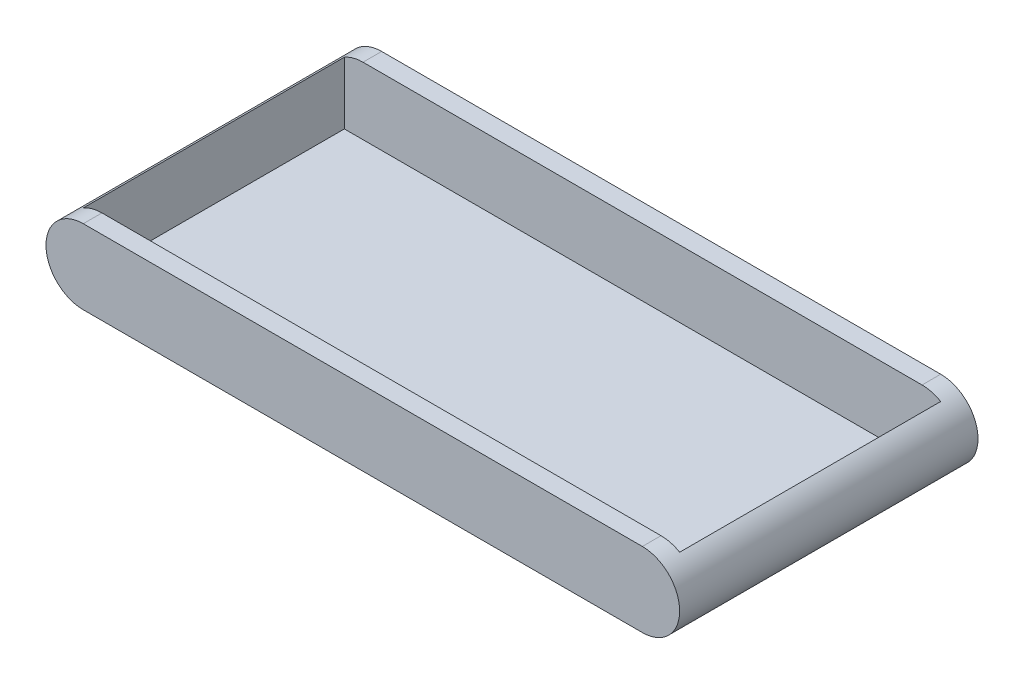
ISO-10303-21;
HEADER;
FILE_DESCRIPTION(('STEP AP214'),'2;1');
FILE_NAME('part.step','',(''),(''),'','','');
FILE_SCHEMA(('AUTOMOTIVE_DESIGN { 1 0 10303 214 1 1 1 1 }'));
ENDSEC;
DATA;
#1=APPLICATION_CONTEXT('core data for automotive mechanical design processes');
#2=APPLICATION_PROTOCOL_DEFINITION('international standard','automotive_design',2000,#1);
#3=PRODUCT_CONTEXT('',#1,'mechanical');
#4=PRODUCT('Part','Part','',(#3));
#5=PRODUCT_RELATED_PRODUCT_CATEGORY('part','',(#4));
#6=PRODUCT_DEFINITION_FORMATION('','',#4);
#7=PRODUCT_DEFINITION_CONTEXT('part definition',#1,'design');
#8=PRODUCT_DEFINITION('design','',#6,#7);
#9=PRODUCT_DEFINITION_SHAPE('','',#8);
#10=(LENGTH_UNIT() NAMED_UNIT(*) SI_UNIT(.MILLI.,.METRE.));
#11=(NAMED_UNIT(*) PLANE_ANGLE_UNIT() SI_UNIT($,.RADIAN.));
#12=(NAMED_UNIT(*) SI_UNIT($,.STERADIAN.) SOLID_ANGLE_UNIT());
#13=UNCERTAINTY_MEASURE_WITH_UNIT(LENGTH_MEASURE(1.E-05),#10,'distance_accuracy_value','');
#14=(GEOMETRIC_REPRESENTATION_CONTEXT(3) GLOBAL_UNCERTAINTY_ASSIGNED_CONTEXT((#13)) GLOBAL_UNIT_ASSIGNED_CONTEXT((#10,
#11,#12)) REPRESENTATION_CONTEXT('',''));
#15=CARTESIAN_POINT('',(0.,0.,0.));
#16=DIRECTION('',(0.,0.,1.));
#17=DIRECTION('',(1.,0.,0.));
#18=AXIS2_PLACEMENT_3D('',#15,#16,#17);
#19=CARTESIAN_POINT('',(-3.9005335742605,10.8864749494863,-80.));
#20=DIRECTION('',(0.,1.,0.));
#21=DIRECTION('',(-1.,0.,0.));
#22=AXIS2_PLACEMENT_3D('',#19,#20,#21);
#23=PLANE('',#22);
#24=DIRECTION('',(-1.,0.,0.));
#25=VECTOR('',#24,1.);
#26=CARTESIAN_POINT('',(-28.9005335742605,10.8864749494863,-75.));
#27=LINE('',#26,#25);
#28=CARTESIAN_POINT('',(126.003276993405,10.8864749494863,-75.));
#29=VERTEX_POINT('',#28);
#30=CARTESIAN_POINT('',(-23.9005335742605,10.8864749494863,-75.));
#31=VERTEX_POINT('',#30);
#32=EDGE_CURVE('E149',#29,#31,#27,.T.);
#33=ORIENTED_EDGE('',*,*,#32,.F.);
#34=DIRECTION('',(0.,0.,1.));
#35=VECTOR('',#34,1.);
#36=CARTESIAN_POINT('',(126.003276993405,10.8864749494863,-80.));
#37=LINE('',#36,#35);
#38=CARTESIAN_POINT('',(126.003276993405,10.8864749494863,-80.));
#39=VERTEX_POINT('',#38);
#40=EDGE_CURVE('E188',#39,#29,#37,.T.);
#41=ORIENTED_EDGE('',*,*,#40,.F.);
#42=DIRECTION('',(-1.,0.,0.));
#43=VECTOR('',#42,1.);
#44=CARTESIAN_POINT('',(-3.9005335742605,10.8864749494863,-80.));
#45=LINE('',#44,#43);
#46=CARTESIAN_POINT('',(-23.9005335742605,10.8864749494862,-80.));
#47=VERTEX_POINT('',#46);
#48=EDGE_CURVE('E61',#39,#47,#45,.T.);
#49=ORIENTED_EDGE('',*,*,#48,.T.);
#50=DIRECTION('',(0.,0.,1.));
#51=VECTOR('',#50,1.);
#52=CARTESIAN_POINT('',(-23.9005335742605,10.8864749494862,-80.));
#53=LINE('',#52,#51);
#54=EDGE_CURVE('E185',#47,#31,#53,.T.);
#55=ORIENTED_EDGE('',*,*,#54,.T.);
#56=EDGE_LOOP('',(#33,#41,#49,#55));
#57=FACE_BOUND('',#56,.T.);
#58=ADVANCED_FACE('F37',(#57),#23,.T.);
#59=CARTESIAN_POINT('',(-23.9005335742605,0.886474949486293,-80.));
#60=DIRECTION('',(0.,0.,1.));
#61=DIRECTION('',(1.,0.,0.));
#62=AXIS2_PLACEMENT_3D('',#59,#60,#61);
#63=CYLINDRICAL_SURFACE('',#62,9.99999999999996);
#64=CARTESIAN_POINT('',(-23.9005335742605,0.886474949486293,-75.));
#65=DIRECTION('',(0.,0.,-1.));
#66=DIRECTION('',(-1.,0.,0.));
#67=AXIS2_PLACEMENT_3D('',#64,#65,#66);
#68=CIRCLE('',#67,9.99999999999996);
#69=CARTESIAN_POINT('',(-28.9005335742605,9.54672898733065,-75.));
#70=VERTEX_POINT('',#69);
#71=EDGE_CURVE('E131',#31,#70,#68,.F.);
#72=ORIENTED_EDGE('',*,*,#71,.F.);
#73=ORIENTED_EDGE('',*,*,#54,.F.);
#74=CARTESIAN_POINT('',(-23.9005335742605,0.886474949486293,-80.));
#75=DIRECTION('',(0.,0.,1.));
#76=DIRECTION('',(1.,0.,0.));
#77=AXIS2_PLACEMENT_3D('',#74,#75,#76);
#78=CIRCLE('',#77,9.99999999999996);
#79=CARTESIAN_POINT('',(-23.9005335742605,-9.11352505051366,-80.));
#80=VERTEX_POINT('',#79);
#81=EDGE_CURVE('E165',#47,#80,#78,.T.);
#82=ORIENTED_EDGE('',*,*,#81,.T.);
#83=DIRECTION('',(0.,0.,1.));
#84=VECTOR('',#83,1.);
#85=CARTESIAN_POINT('',(-23.9005335742605,-9.11352505051366,-80.));
#86=LINE('',#85,#84);
#87=CARTESIAN_POINT('',(-23.9005335742605,-9.11352505051366,0.));
#88=VERTEX_POINT('',#87);
#89=EDGE_CURVE('E89',#80,#88,#86,.T.);
#90=ORIENTED_EDGE('',*,*,#89,.T.);
#91=CARTESIAN_POINT('',(-23.9005335742605,0.886474949486293,0.));
#92=DIRECTION('',(0.,0.,1.));
#93=DIRECTION('',(1.,0.,0.));
#94=AXIS2_PLACEMENT_3D('',#91,#92,#93);
#95=CIRCLE('',#94,9.99999999999996);
#96=CARTESIAN_POINT('',(-23.9005335742605,10.8864749494862,0.));
#97=VERTEX_POINT('',#96);
#98=EDGE_CURVE('E164',#97,#88,#95,.T.);
#99=ORIENTED_EDGE('',*,*,#98,.F.);
#100=CARTESIAN_POINT('',(-23.9005335742605,10.8864749494863,-5.));
#101=VERTEX_POINT('',#100);
#102=EDGE_CURVE('E82',#101,#97,#53,.T.);
#103=ORIENTED_EDGE('',*,*,#102,.F.);
#104=CARTESIAN_POINT('',(-23.9005335742605,0.886474949486293,-5.));
#105=DIRECTION('',(0.,0.,1.));
#106=DIRECTION('',(1.,0.,0.));
#107=AXIS2_PLACEMENT_3D('',#104,#105,#106);
#108=CIRCLE('',#107,9.99999999999996);
#109=CARTESIAN_POINT('',(-28.9005335742604,9.54672898733065,-5.));
#110=VERTEX_POINT('',#109);
#111=EDGE_CURVE('E157',#110,#101,#108,.F.);
#112=ORIENTED_EDGE('',*,*,#111,.F.);
#113=DIRECTION('',(0.,0.,1.));
#114=VECTOR('',#113,1.);
#115=CARTESIAN_POINT('',(-28.9005335742605,9.54672898733065,-80.));
#116=LINE('',#115,#114);
#117=EDGE_CURVE('E11',#70,#110,#116,.T.);
#118=ORIENTED_EDGE('',*,*,#117,.F.);
#119=EDGE_LOOP('',(#72,#73,#82,#90,#99,#103,#112,#118));
#120=FACE_BOUND('',#119,.T.);
#121=ADVANCED_FACE('F39',(#120),#63,.T.);
#122=DIRECTION('',(1.,0.,0.));
#123=VECTOR('',#122,1.);
#124=CARTESIAN_POINT('',(-28.9005335742604,10.8864749494863,-5.));
#125=LINE('',#124,#123);
#126=CARTESIAN_POINT('',(126.003276993405,10.8864749494863,-5.));
#127=VERTEX_POINT('',#126);
#128=EDGE_CURVE('E52',#101,#127,#125,.T.);
#129=ORIENTED_EDGE('',*,*,#128,.F.);
#130=ORIENTED_EDGE('',*,*,#102,.T.);
#131=DIRECTION('',(-1.,0.,0.));
#132=VECTOR('',#131,1.);
#133=CARTESIAN_POINT('',(-3.9005335742605,10.8864749494863,0.));
#134=LINE('',#133,#132);
#135=CARTESIAN_POINT('',(126.003276993405,10.8864749494863,0.));
#136=VERTEX_POINT('',#135);
#137=EDGE_CURVE('E169',#136,#97,#134,.T.);
#138=ORIENTED_EDGE('',*,*,#137,.F.);
#139=EDGE_CURVE('E191',#127,#136,#37,.T.);
#140=ORIENTED_EDGE('',*,*,#139,.F.);
#141=EDGE_LOOP('',(#129,#130,#138,#140));
#142=FACE_BOUND('',#141,.T.);
#143=ADVANCED_FACE('F214',(#142),#23,.T.);
#144=CARTESIAN_POINT('',(126.003276993405,0.886474949486293,-80.));
#145=DIRECTION('',(0.,0.,1.));
#146=DIRECTION('',(1.,0.,0.));
#147=AXIS2_PLACEMENT_3D('',#144,#145,#146);
#148=CYLINDRICAL_SURFACE('',#147,9.99999999999996);
#149=CARTESIAN_POINT('',(126.003276993405,0.886474949486293,-75.));
#150=DIRECTION('',(0.,0.,-1.));
#151=DIRECTION('',(-1.,0.,0.));
#152=AXIS2_PLACEMENT_3D('',#149,#150,#151);
#153=CIRCLE('',#152,9.99999999999996);
#154=CARTESIAN_POINT('',(131.003276993405,9.54672898733066,-75.));
#155=VERTEX_POINT('',#154);
#156=EDGE_CURVE('E45',#155,#29,#153,.F.);
#157=ORIENTED_EDGE('',*,*,#156,.F.);
#158=DIRECTION('',(0.,0.,1.));
#159=VECTOR('',#158,1.);
#160=CARTESIAN_POINT('',(131.003276993405,9.54672898733066,-80.));
#161=LINE('',#160,#159);
#162=CARTESIAN_POINT('',(131.003276993405,9.54672898733066,-5.));
#163=VERTEX_POINT('',#162);
#164=EDGE_CURVE('E196',#163,#155,#161,.F.);
#165=ORIENTED_EDGE('',*,*,#164,.F.);
#166=CARTESIAN_POINT('',(126.003276993405,0.886474949486293,-5.));
#167=DIRECTION('',(0.,0.,1.));
#168=DIRECTION('',(1.,0.,0.));
#169=AXIS2_PLACEMENT_3D('',#166,#167,#168);
#170=CIRCLE('',#169,9.99999999999996);
#171=EDGE_CURVE('E187',#127,#163,#170,.F.);
#172=ORIENTED_EDGE('',*,*,#171,.F.);
#173=ORIENTED_EDGE('',*,*,#139,.T.);
#174=CARTESIAN_POINT('',(126.003276993405,0.886474949486293,0.));
#175=DIRECTION('',(0.,0.,1.));
#176=DIRECTION('',(1.,0.,0.));
#177=AXIS2_PLACEMENT_3D('',#174,#175,#176);
#178=CIRCLE('',#177,9.99999999999996);
#179=CARTESIAN_POINT('',(126.003276993405,-9.11352505051367,0.));
#180=VERTEX_POINT('',#179);
#181=EDGE_CURVE('E180',#180,#136,#178,.T.);
#182=ORIENTED_EDGE('',*,*,#181,.F.);
#183=DIRECTION('',(0.,0.,1.));
#184=VECTOR('',#183,1.);
#185=CARTESIAN_POINT('',(126.003276993405,-9.11352505051367,-80.));
#186=LINE('',#185,#184);
#187=CARTESIAN_POINT('',(126.003276993405,-9.11352505051367,-80.));
#188=VERTEX_POINT('',#187);
#189=EDGE_CURVE('E192',#188,#180,#186,.T.);
#190=ORIENTED_EDGE('',*,*,#189,.F.);
#191=CARTESIAN_POINT('',(126.003276993405,0.886474949486293,-80.));
#192=DIRECTION('',(0.,0.,1.));
#193=DIRECTION('',(1.,0.,0.));
#194=AXIS2_PLACEMENT_3D('',#191,#192,#193);
#195=CIRCLE('',#194,9.99999999999996);
#196=EDGE_CURVE('E171',#188,#39,#195,.T.);
#197=ORIENTED_EDGE('',*,*,#196,.T.);
#198=ORIENTED_EDGE('',*,*,#40,.T.);
#199=EDGE_LOOP('',(#157,#165,#172,#173,#182,#190,#197,#198));
#200=FACE_BOUND('',#199,.T.);
#201=ADVANCED_FACE('F201',(#200),#148,.T.);
#202=CARTESIAN_POINT('',(-3.90053357426048,-9.11352505051367,-80.));
#203=DIRECTION('',(0.,-1.,0.));
#204=DIRECTION('',(0.,0.,-1.));
#205=AXIS2_PLACEMENT_3D('',#202,#203,#204);
#206=PLANE('',#205);
#207=DIRECTION('',(1.,0.,0.));
#208=VECTOR('',#207,1.);
#209=CARTESIAN_POINT('',(-3.90053357426048,-9.11352505051367,0.));
#210=LINE('',#209,#208);
#211=EDGE_CURVE('E177',#88,#180,#210,.T.);
#212=ORIENTED_EDGE('',*,*,#211,.F.);
#213=ORIENTED_EDGE('',*,*,#89,.F.);
#214=DIRECTION('',(1.,0.,0.));
#215=VECTOR('',#214,1.);
#216=CARTESIAN_POINT('',(-23.9005335742605,-9.11352505051366,-80.));
#217=LINE('',#216,#215);
#218=EDGE_CURVE('E168',#80,#188,#217,.T.);
#219=ORIENTED_EDGE('',*,*,#218,.T.);
#220=ORIENTED_EDGE('',*,*,#189,.T.);
#221=EDGE_LOOP('',(#212,#213,#219,#220));
#222=FACE_BOUND('',#221,.T.);
#223=ADVANCED_FACE('F217',(#222),#206,.T.);
#224=CARTESIAN_POINT('',(-23.9005335742605,0.886474949486293,-80.));
#225=DIRECTION('',(0.,0.,1.));
#226=DIRECTION('',(1.,0.,0.));
#227=AXIS2_PLACEMENT_3D('',#224,#225,#226);
#228=PLANE('',#227);
#229=ORIENTED_EDGE('',*,*,#81,.F.);
#230=ORIENTED_EDGE('',*,*,#48,.F.);
#231=ORIENTED_EDGE('',*,*,#196,.F.);
#232=ORIENTED_EDGE('',*,*,#218,.F.);
#233=EDGE_LOOP('',(#229,#230,#231,#232));
#234=FACE_BOUND('',#233,.T.);
#235=ADVANCED_FACE('F207',(#234),#228,.F.);
#236=CARTESIAN_POINT('',(-23.9005335742605,0.886474949486293,0.));
#237=DIRECTION('',(0.,0.,1.));
#238=DIRECTION('',(1.,0.,0.));
#239=AXIS2_PLACEMENT_3D('',#236,#237,#238);
#240=PLANE('',#239);
#241=ORIENTED_EDGE('',*,*,#98,.T.);
#242=ORIENTED_EDGE('',*,*,#211,.T.);
#243=ORIENTED_EDGE('',*,*,#181,.T.);
#244=ORIENTED_EDGE('',*,*,#137,.T.);
#245=EDGE_LOOP('',(#241,#242,#243,#244));
#246=FACE_BOUND('',#245,.T.);
#247=ADVANCED_FACE('F216',(#246),#240,.T.);
#248=CARTESIAN_POINT('',(-28.9005335742605,-7.11352505051375,-75.));
#249=DIRECTION('',(0.,0.,-1.));
#250=DIRECTION('',(-1.,0.,0.));
#251=AXIS2_PLACEMENT_3D('',#248,#249,#250);
#252=PLANE('',#251);
#253=ORIENTED_EDGE('',*,*,#71,.T.);
#254=DIRECTION('',(0.,1.,0.));
#255=VECTOR('',#254,1.);
#256=CARTESIAN_POINT('',(-28.9005335742605,-7.11352505051375,-75.));
#257=LINE('',#256,#255);
#258=CARTESIAN_POINT('',(-28.9005335742605,-7.11352505051375,-75.));
#259=VERTEX_POINT('',#258);
#260=EDGE_CURVE('E123',#259,#70,#257,.T.);
#261=ORIENTED_EDGE('',*,*,#260,.F.);
#262=DIRECTION('',(-1.,0.,0.));
#263=VECTOR('',#262,1.);
#264=CARTESIAN_POINT('',(-28.9005335742605,-7.11352505051375,-75.));
#265=LINE('',#264,#263);
#266=CARTESIAN_POINT('',(131.003276993405,-7.11352505051373,-75.));
#267=VERTEX_POINT('',#266);
#268=EDGE_CURVE('E128',#267,#259,#265,.T.);
#269=ORIENTED_EDGE('',*,*,#268,.F.);
#270=DIRECTION('',(0.,1.,0.));
#271=VECTOR('',#270,1.);
#272=CARTESIAN_POINT('',(131.003276993405,-7.11352505051373,-75.));
#273=LINE('',#272,#271);
#274=EDGE_CURVE('E155',#267,#155,#273,.T.);
#275=ORIENTED_EDGE('',*,*,#274,.T.);
#276=ORIENTED_EDGE('',*,*,#156,.T.);
#277=ORIENTED_EDGE('',*,*,#32,.T.);
#278=EDGE_LOOP('',(#253,#261,#269,#275,#276,#277));
#279=FACE_BOUND('',#278,.T.);
#280=ADVANCED_FACE('F125',(#279),#252,.F.);
#281=CARTESIAN_POINT('',(131.003276993405,-7.11352505051373,-75.));
#282=DIRECTION('',(1.,0.,0.));
#283=DIRECTION('',(0.,1.,0.));
#284=AXIS2_PLACEMENT_3D('',#281,#282,#283);
#285=PLANE('',#284);
#286=ORIENTED_EDGE('',*,*,#164,.T.);
#287=ORIENTED_EDGE('',*,*,#274,.F.);
#288=DIRECTION('',(0.,0.,-1.));
#289=VECTOR('',#288,1.);
#290=CARTESIAN_POINT('',(131.003276993405,-7.11352505051373,-75.));
#291=LINE('',#290,#289);
#292=CARTESIAN_POINT('',(131.003276993405,-7.11352505051373,-5.));
#293=VERTEX_POINT('',#292);
#294=EDGE_CURVE('E135',#293,#267,#291,.T.);
#295=ORIENTED_EDGE('',*,*,#294,.F.);
#296=DIRECTION('',(0.,1.,0.));
#297=VECTOR('',#296,1.);
#298=CARTESIAN_POINT('',(131.003276993405,-7.11352505051373,-5.));
#299=LINE('',#298,#297);
#300=EDGE_CURVE('E158',#293,#163,#299,.T.);
#301=ORIENTED_EDGE('',*,*,#300,.T.);
#302=EDGE_LOOP('',(#286,#287,#295,#301));
#303=FACE_BOUND('',#302,.T.);
#304=ADVANCED_FACE('F212',(#303),#285,.F.);
#305=CARTESIAN_POINT('',(-28.9005335742604,-7.11352505051375,-5.));
#306=DIRECTION('',(0.,0.,1.));
#307=DIRECTION('',(1.,0.,0.));
#308=AXIS2_PLACEMENT_3D('',#305,#306,#307);
#309=PLANE('',#308);
#310=ORIENTED_EDGE('',*,*,#111,.T.);
#311=ORIENTED_EDGE('',*,*,#128,.T.);
#312=ORIENTED_EDGE('',*,*,#171,.T.);
#313=ORIENTED_EDGE('',*,*,#300,.F.);
#314=DIRECTION('',(1.,0.,0.));
#315=VECTOR('',#314,1.);
#316=CARTESIAN_POINT('',(-28.9005335742604,-7.11352505051375,-5.));
#317=LINE('',#316,#315);
#318=CARTESIAN_POINT('',(-28.9005335742604,-7.11352505051375,-5.));
#319=VERTEX_POINT('',#318);
#320=EDGE_CURVE('E144',#319,#293,#317,.T.);
#321=ORIENTED_EDGE('',*,*,#320,.F.);
#322=DIRECTION('',(0.,1.,0.));
#323=VECTOR('',#322,1.);
#324=CARTESIAN_POINT('',(-28.9005335742604,-7.11352505051375,-5.));
#325=LINE('',#324,#323);
#326=EDGE_CURVE('E134',#319,#110,#325,.T.);
#327=ORIENTED_EDGE('',*,*,#326,.T.);
#328=EDGE_LOOP('',(#310,#311,#312,#313,#321,#327));
#329=FACE_BOUND('',#328,.T.);
#330=ADVANCED_FACE('F210',(#329),#309,.F.);
#331=CARTESIAN_POINT('',(-28.9005335742605,-7.11352505051375,-75.));
#332=DIRECTION('',(-1.,0.,0.));
#333=DIRECTION('',(0.,0.,1.));
#334=AXIS2_PLACEMENT_3D('',#331,#332,#333);
#335=PLANE('',#334);
#336=ORIENTED_EDGE('',*,*,#117,.T.);
#337=ORIENTED_EDGE('',*,*,#326,.F.);
#338=DIRECTION('',(0.,0.,1.));
#339=VECTOR('',#338,1.);
#340=CARTESIAN_POINT('',(-28.9005335742605,-7.11352505051375,-75.));
#341=LINE('',#340,#339);
#342=EDGE_CURVE('E138',#259,#319,#341,.T.);
#343=ORIENTED_EDGE('',*,*,#342,.F.);
#344=ORIENTED_EDGE('',*,*,#260,.T.);
#345=EDGE_LOOP('',(#336,#337,#343,#344));
#346=FACE_BOUND('',#345,.T.);
#347=ADVANCED_FACE('F139',(#346),#335,.F.);
#348=CARTESIAN_POINT('',(0.,-7.11352505051375,0.));
#349=DIRECTION('',(0.,-1.,0.));
#350=DIRECTION('',(1.,0.,0.));
#351=AXIS2_PLACEMENT_3D('',#348,#349,#350);
#352=PLANE('',#351);
#353=ORIENTED_EDGE('',*,*,#268,.T.);
#354=ORIENTED_EDGE('',*,*,#342,.T.);
#355=ORIENTED_EDGE('',*,*,#320,.T.);
#356=ORIENTED_EDGE('',*,*,#294,.T.);
#357=EDGE_LOOP('',(#353,#354,#355,#356));
#358=FACE_BOUND('',#357,.T.);
#359=ADVANCED_FACE('F146',(#358),#352,.F.);
#360=CLOSED_SHELL('',(#58,#121,#143,#201,#223,#235,#247,#280,#304,#330,#347,#359));
#361=MANIFOLD_SOLID_BREP('B2',#360);
#362=ADVANCED_BREP_SHAPE_REPRESENTATION('',(#18,#361),#14);
#363=SHAPE_DEFINITION_REPRESENTATION(#9,#362);
ENDSEC;
END-ISO-10303-21;
